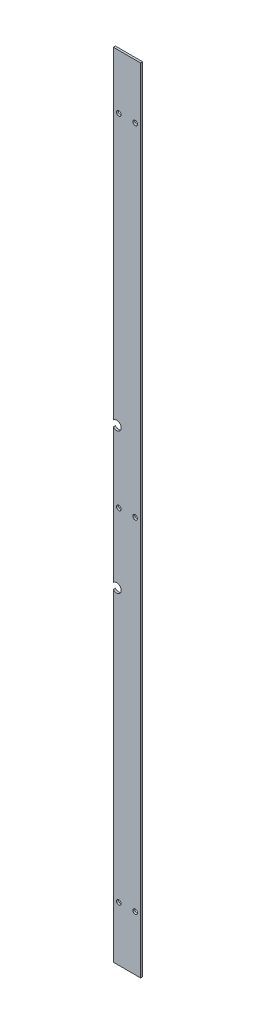
ISO-10303-21;
HEADER;
FILE_DESCRIPTION(('STEP AP214'),'2;1');
FILE_NAME('part.step','',(''),(''),'','','');
FILE_SCHEMA(('AUTOMOTIVE_DESIGN { 1 0 10303 214 1 1 1 1 }'));
ENDSEC;
DATA;
#1=APPLICATION_CONTEXT('core data for automotive mechanical design processes');
#2=APPLICATION_PROTOCOL_DEFINITION('international standard','automotive_design',2000,#1);
#3=PRODUCT_CONTEXT('',#1,'mechanical');
#4=PRODUCT('Part','Part','',(#3));
#5=PRODUCT_RELATED_PRODUCT_CATEGORY('part','',(#4));
#6=PRODUCT_DEFINITION_FORMATION('','',#4);
#7=PRODUCT_DEFINITION_CONTEXT('part definition',#1,'design');
#8=PRODUCT_DEFINITION('design','',#6,#7);
#9=PRODUCT_DEFINITION_SHAPE('','',#8);
#10=(LENGTH_UNIT() NAMED_UNIT(*) SI_UNIT(.MILLI.,.METRE.));
#11=(NAMED_UNIT(*) PLANE_ANGLE_UNIT() SI_UNIT($,.RADIAN.));
#12=(NAMED_UNIT(*) SI_UNIT($,.STERADIAN.) SOLID_ANGLE_UNIT());
#13=UNCERTAINTY_MEASURE_WITH_UNIT(LENGTH_MEASURE(1.E-05),#10,'distance_accuracy_value','');
#14=(GEOMETRIC_REPRESENTATION_CONTEXT(3) GLOBAL_UNCERTAINTY_ASSIGNED_CONTEXT((#13)) GLOBAL_UNIT_ASSIGNED_CONTEXT((#10,
#11,#12)) REPRESENTATION_CONTEXT('',''));
#15=CARTESIAN_POINT('',(0.,0.,0.));
#16=DIRECTION('',(0.,0.,1.));
#17=DIRECTION('',(1.,0.,0.));
#18=AXIS2_PLACEMENT_3D('',#15,#16,#17);
#19=CARTESIAN_POINT('',(75.,-51.4999999999999,108.5));
#20=DIRECTION('',(0.,0.,1.));
#21=DIRECTION('',(1.,0.,0.));
#22=AXIS2_PLACEMENT_3D('',#19,#20,#21);
#23=CYLINDRICAL_SURFACE('',#22,3.29999999999988);
#24=CARTESIAN_POINT('',(75.,-51.4999999999999,110.));
#25=DIRECTION('',(0.,0.,-1.));
#26=DIRECTION('',(1.,0.,0.));
#27=AXIS2_PLACEMENT_3D('',#24,#25,#26);
#28=CIRCLE('',#27,3.29999999999988);
#29=CARTESIAN_POINT('',(72.5000000000001,-49.3459340771464,110.));
#30=VERTEX_POINT('',#29);
#31=CARTESIAN_POINT('',(72.4999999999999,-53.6540659228537,110.));
#32=VERTEX_POINT('',#31);
#33=EDGE_CURVE('E158',#30,#32,#28,.T.);
#34=ORIENTED_EDGE('',*,*,#33,.F.);
#35=DIRECTION('',(0.,0.,1.));
#36=VECTOR('',#35,1.);
#37=CARTESIAN_POINT('',(72.5000000000001,-49.3459340771464,108.5));
#38=LINE('',#37,#36);
#39=CARTESIAN_POINT('',(72.5000000000001,-49.3459340771464,108.5));
#40=VERTEX_POINT('',#39);
#41=EDGE_CURVE('E11',#40,#30,#38,.T.);
#42=ORIENTED_EDGE('',*,*,#41,.F.);
#43=CARTESIAN_POINT('',(75.,-51.4999999999999,108.5));
#44=DIRECTION('',(0.,0.,-1.));
#45=DIRECTION('',(1.,0.,0.));
#46=AXIS2_PLACEMENT_3D('',#43,#44,#45);
#47=CIRCLE('',#46,3.30000000000006);
#48=CARTESIAN_POINT('',(72.4999999999999,-53.6540659228537,108.5));
#49=VERTEX_POINT('',#48);
#50=EDGE_CURVE('E58',#40,#49,#47,.T.);
#51=ORIENTED_EDGE('',*,*,#50,.T.);
#52=DIRECTION('',(0.,0.,1.));
#53=VECTOR('',#52,1.);
#54=CARTESIAN_POINT('',(72.4999999999999,-53.6540659228537,108.5));
#55=LINE('',#54,#53);
#56=EDGE_CURVE('E44',#49,#32,#55,.T.);
#57=ORIENTED_EDGE('',*,*,#56,.T.);
#58=EDGE_LOOP('',(#34,#42,#51,#57));
#59=FACE_BOUND('',#58,.T.);
#60=ADVANCED_FACE('F41',(#59),#23,.F.);
#61=CARTESIAN_POINT('',(72.5,49.3459340771462,108.5));
#62=DIRECTION('',(-1.,0.,0.));
#63=DIRECTION('',(0.,-1.,0.));
#64=AXIS2_PLACEMENT_3D('',#61,#62,#63);
#65=PLANE('',#64);
#66=DIRECTION('',(0.,-1.,0.));
#67=VECTOR('',#66,1.);
#68=CARTESIAN_POINT('',(72.5,49.3459340771462,110.));
#69=LINE('',#68,#67);
#70=CARTESIAN_POINT('',(72.5,49.3459340771462,110.));
#71=VERTEX_POINT('',#70);
#72=EDGE_CURVE('E156',#71,#30,#69,.T.);
#73=ORIENTED_EDGE('',*,*,#72,.F.);
#74=DIRECTION('',(0.,0.,1.));
#75=VECTOR('',#74,1.);
#76=CARTESIAN_POINT('',(72.5,49.3459340771462,108.5));
#77=LINE('',#76,#75);
#78=CARTESIAN_POINT('',(72.5,49.3459340771462,108.5));
#79=VERTEX_POINT('',#78);
#80=EDGE_CURVE('E51',#79,#71,#77,.T.);
#81=ORIENTED_EDGE('',*,*,#80,.F.);
#82=DIRECTION('',(0.,-1.,0.));
#83=VECTOR('',#82,1.);
#84=CARTESIAN_POINT('',(72.5,49.3459340771462,108.5));
#85=LINE('',#84,#83);
#86=EDGE_CURVE('E128',#79,#40,#85,.T.);
#87=ORIENTED_EDGE('',*,*,#86,.T.);
#88=ORIENTED_EDGE('',*,*,#41,.T.);
#89=EDGE_LOOP('',(#73,#81,#87,#88));
#90=FACE_BOUND('',#89,.T.);
#91=ADVANCED_FACE('F172',(#90),#65,.T.);
#92=CARTESIAN_POINT('',(75.0000000000001,51.5000000000001,108.5));
#93=DIRECTION('',(0.,0.,1.));
#94=DIRECTION('',(1.,0.,0.));
#95=AXIS2_PLACEMENT_3D('',#92,#93,#94);
#96=CYLINDRICAL_SURFACE('',#95,3.30000000000015);
#97=CARTESIAN_POINT('',(75.0000000000001,51.5000000000001,110.));
#98=DIRECTION('',(0.,0.,-1.));
#99=DIRECTION('',(1.,0.,0.));
#100=AXIS2_PLACEMENT_3D('',#97,#98,#99);
#101=CIRCLE('',#100,3.30000000000015);
#102=CARTESIAN_POINT('',(72.4999999999998,53.6540659228538,110.));
#103=VERTEX_POINT('',#102);
#104=EDGE_CURVE('E119',#103,#71,#101,.T.);
#105=ORIENTED_EDGE('',*,*,#104,.F.);
#106=DIRECTION('',(0.,0.,1.));
#107=VECTOR('',#106,1.);
#108=CARTESIAN_POINT('',(72.4999999999998,53.6540659228538,108.5));
#109=LINE('',#108,#107);
#110=CARTESIAN_POINT('',(72.4999999999998,53.6540659228538,108.5));
#111=VERTEX_POINT('',#110);
#112=EDGE_CURVE('E114',#111,#103,#109,.T.);
#113=ORIENTED_EDGE('',*,*,#112,.F.);
#114=CARTESIAN_POINT('',(75.0000000000001,51.5000000000001,108.5));
#115=DIRECTION('',(0.,0.,-1.));
#116=DIRECTION('',(1.,0.,0.));
#117=AXIS2_PLACEMENT_3D('',#114,#115,#116);
#118=CIRCLE('',#117,3.30000000000013);
#119=EDGE_CURVE('E117',#111,#79,#118,.T.);
#120=ORIENTED_EDGE('',*,*,#119,.T.);
#121=ORIENTED_EDGE('',*,*,#80,.T.);
#122=EDGE_LOOP('',(#105,#113,#120,#121));
#123=FACE_BOUND('',#122,.T.);
#124=ADVANCED_FACE('F113',(#123),#96,.F.);
#125=CARTESIAN_POINT('',(72.5,290.,108.5));
#126=DIRECTION('',(-1.,0.,0.));
#127=DIRECTION('',(0.,-1.,0.));
#128=AXIS2_PLACEMENT_3D('',#125,#126,#127);
#129=PLANE('',#128);
#130=DIRECTION('',(0.,-1.,0.));
#131=VECTOR('',#130,1.);
#132=CARTESIAN_POINT('',(72.5,290.,110.));
#133=LINE('',#132,#131);
#134=CARTESIAN_POINT('',(72.5,290.,110.));
#135=VERTEX_POINT('',#134);
#136=EDGE_CURVE('E153',#135,#103,#133,.T.);
#137=ORIENTED_EDGE('',*,*,#136,.F.);
#138=DIRECTION('',(0.,0.,1.));
#139=VECTOR('',#138,1.);
#140=CARTESIAN_POINT('',(72.5,290.,108.5));
#141=LINE('',#140,#139);
#142=CARTESIAN_POINT('',(72.5,290.,108.5));
#143=VERTEX_POINT('',#142);
#144=EDGE_CURVE('E124',#143,#135,#141,.T.);
#145=ORIENTED_EDGE('',*,*,#144,.F.);
#146=DIRECTION('',(0.,-1.,0.));
#147=VECTOR('',#146,1.);
#148=CARTESIAN_POINT('',(72.5,290.,108.5));
#149=LINE('',#148,#147);
#150=EDGE_CURVE('E126',#143,#111,#149,.T.);
#151=ORIENTED_EDGE('',*,*,#150,.T.);
#152=ORIENTED_EDGE('',*,*,#112,.T.);
#153=EDGE_LOOP('',(#137,#145,#151,#152));
#154=FACE_BOUND('',#153,.T.);
#155=ADVANCED_FACE('F135',(#154),#129,.T.);
#156=CARTESIAN_POINT('',(72.5,290.,108.5));
#157=DIRECTION('',(0.,1.,0.));
#158=DIRECTION('',(0.,0.,1.));
#159=AXIS2_PLACEMENT_3D('',#156,#157,#158);
#160=PLANE('',#159);
#161=DIRECTION('',(-1.,0.,0.));
#162=VECTOR('',#161,1.);
#163=CARTESIAN_POINT('',(72.5,290.,110.));
#164=LINE('',#163,#162);
#165=CARTESIAN_POINT('',(92.5,290.,110.));
#166=VERTEX_POINT('',#165);
#167=EDGE_CURVE('E147',#166,#135,#164,.T.);
#168=ORIENTED_EDGE('',*,*,#167,.F.);
#169=DIRECTION('',(0.,0.,1.));
#170=VECTOR('',#169,1.);
#171=CARTESIAN_POINT('',(92.5,290.,108.5));
#172=LINE('',#171,#170);
#173=CARTESIAN_POINT('',(92.5,290.,108.5));
#174=VERTEX_POINT('',#173);
#175=EDGE_CURVE('E165',#174,#166,#172,.T.);
#176=ORIENTED_EDGE('',*,*,#175,.F.);
#177=DIRECTION('',(-1.,0.,0.));
#178=VECTOR('',#177,1.);
#179=CARTESIAN_POINT('',(72.5,290.,108.5));
#180=LINE('',#179,#178);
#181=EDGE_CURVE('E134',#174,#143,#180,.T.);
#182=ORIENTED_EDGE('',*,*,#181,.T.);
#183=ORIENTED_EDGE('',*,*,#144,.T.);
#184=EDGE_LOOP('',(#168,#176,#182,#183));
#185=FACE_BOUND('',#184,.T.);
#186=ADVANCED_FACE('F184',(#185),#160,.T.);
#187=CARTESIAN_POINT('',(92.5,290.,108.5));
#188=DIRECTION('',(1.,0.,0.));
#189=DIRECTION('',(0.,0.,-1.));
#190=AXIS2_PLACEMENT_3D('',#187,#188,#189);
#191=PLANE('',#190);
#192=DIRECTION('',(0.,1.,0.));
#193=VECTOR('',#192,1.);
#194=CARTESIAN_POINT('',(92.5,290.,110.));
#195=LINE('',#194,#193);
#196=CARTESIAN_POINT('',(92.5,-290.,110.));
#197=VERTEX_POINT('',#196);
#198=EDGE_CURVE('E150',#197,#166,#195,.T.);
#199=ORIENTED_EDGE('',*,*,#198,.F.);
#200=DIRECTION('',(0.,0.,1.));
#201=VECTOR('',#200,1.);
#202=CARTESIAN_POINT('',(92.5,-290.,108.5));
#203=LINE('',#202,#201);
#204=CARTESIAN_POINT('',(92.5,-290.,108.5));
#205=VERTEX_POINT('',#204);
#206=EDGE_CURVE('E163',#205,#197,#203,.T.);
#207=ORIENTED_EDGE('',*,*,#206,.F.);
#208=DIRECTION('',(0.,1.,0.));
#209=VECTOR('',#208,1.);
#210=CARTESIAN_POINT('',(92.5,290.,108.5));
#211=LINE('',#210,#209);
#212=EDGE_CURVE('E133',#205,#174,#211,.T.);
#213=ORIENTED_EDGE('',*,*,#212,.T.);
#214=ORIENTED_EDGE('',*,*,#175,.T.);
#215=EDGE_LOOP('',(#199,#207,#213,#214));
#216=FACE_BOUND('',#215,.T.);
#217=ADVANCED_FACE('F190',(#216),#191,.T.);
#218=CARTESIAN_POINT('',(72.5,-290.,108.5));
#219=DIRECTION('',(0.,-1.,0.));
#220=DIRECTION('',(0.,0.,-1.));
#221=AXIS2_PLACEMENT_3D('',#218,#219,#220);
#222=PLANE('',#221);
#223=DIRECTION('',(1.,0.,0.));
#224=VECTOR('',#223,1.);
#225=CARTESIAN_POINT('',(72.5,-290.,110.));
#226=LINE('',#225,#224);
#227=CARTESIAN_POINT('',(72.5,-290.,110.));
#228=VERTEX_POINT('',#227);
#229=EDGE_CURVE('E141',#228,#197,#226,.T.);
#230=ORIENTED_EDGE('',*,*,#229,.F.);
#231=DIRECTION('',(0.,0.,1.));
#232=VECTOR('',#231,1.);
#233=CARTESIAN_POINT('',(72.5,-290.,108.5));
#234=LINE('',#233,#232);
#235=CARTESIAN_POINT('',(72.5,-290.,108.5));
#236=VERTEX_POINT('',#235);
#237=EDGE_CURVE('E164',#236,#228,#234,.T.);
#238=ORIENTED_EDGE('',*,*,#237,.F.);
#239=DIRECTION('',(1.,0.,0.));
#240=VECTOR('',#239,1.);
#241=CARTESIAN_POINT('',(72.5,-290.,108.5));
#242=LINE('',#241,#240);
#243=EDGE_CURVE('E199',#236,#205,#242,.T.);
#244=ORIENTED_EDGE('',*,*,#243,.T.);
#245=ORIENTED_EDGE('',*,*,#206,.T.);
#246=EDGE_LOOP('',(#230,#238,#244,#245));
#247=FACE_BOUND('',#246,.T.);
#248=ADVANCED_FACE('F188',(#247),#222,.T.);
#249=CARTESIAN_POINT('',(72.4999999999999,-53.6540659228537,108.5));
#250=DIRECTION('',(-1.,0.,0.));
#251=DIRECTION('',(0.,-1.,0.));
#252=AXIS2_PLACEMENT_3D('',#249,#250,#251);
#253=PLANE('',#252);
#254=DIRECTION('',(0.,-1.,0.));
#255=VECTOR('',#254,1.);
#256=CARTESIAN_POINT('',(72.4999999999999,-53.6540659228537,110.));
#257=LINE('',#256,#255);
#258=EDGE_CURVE('E138',#32,#228,#257,.T.);
#259=ORIENTED_EDGE('',*,*,#258,.F.);
#260=ORIENTED_EDGE('',*,*,#56,.F.);
#261=DIRECTION('',(0.,-1.,0.));
#262=VECTOR('',#261,1.);
#263=CARTESIAN_POINT('',(72.4999999999999,-53.6540659228537,108.5));
#264=LINE('',#263,#262);
#265=EDGE_CURVE('E204',#49,#236,#264,.T.);
#266=ORIENTED_EDGE('',*,*,#265,.T.);
#267=ORIENTED_EDGE('',*,*,#237,.T.);
#268=EDGE_LOOP('',(#259,#260,#266,#267));
#269=FACE_BOUND('',#268,.T.);
#270=ADVANCED_FACE('F43',(#269),#253,.T.);
#271=CARTESIAN_POINT('',(75.,-51.4999999999999,108.5));
#272=DIRECTION('',(0.,0.,1.));
#273=DIRECTION('',(1.,0.,0.));
#274=AXIS2_PLACEMENT_3D('',#271,#272,#273);
#275=PLANE('',#274);
#276=CARTESIAN_POINT('',(88.5,250.,108.5));
#277=DIRECTION('',(0.,0.,1.));
#278=DIRECTION('',(1.,0.,0.));
#279=AXIS2_PLACEMENT_3D('',#276,#277,#278);
#280=CIRCLE('',#279,1.69999999999999);
#281=CARTESIAN_POINT('',(90.2,250.,108.5));
#282=VERTEX_POINT('',#281);
#283=EDGE_CURVE('E237',#282,#282,#280,.T.);
#284=ORIENTED_EDGE('',*,*,#283,.T.);
#285=EDGE_LOOP('',(#284));
#286=FACE_BOUND('',#285,.T.);
#287=CARTESIAN_POINT('',(88.5,0.,108.5));
#288=DIRECTION('',(0.,0.,1.));
#289=DIRECTION('',(1.,0.,0.));
#290=AXIS2_PLACEMENT_3D('',#287,#288,#289);
#291=CIRCLE('',#290,1.69999999999999);
#292=CARTESIAN_POINT('',(90.2,0.,108.5));
#293=VERTEX_POINT('',#292);
#294=EDGE_CURVE('E228',#293,#293,#291,.T.);
#295=ORIENTED_EDGE('',*,*,#294,.T.);
#296=EDGE_LOOP('',(#295));
#297=FACE_BOUND('',#296,.T.);
#298=CARTESIAN_POINT('',(76.5,250.,108.5));
#299=DIRECTION('',(0.,0.,1.));
#300=DIRECTION('',(1.,0.,0.));
#301=AXIS2_PLACEMENT_3D('',#298,#299,#300);
#302=CIRCLE('',#301,1.69999999999999);
#303=CARTESIAN_POINT('',(78.2,250.,108.5));
#304=VERTEX_POINT('',#303);
#305=EDGE_CURVE('E221',#304,#304,#302,.T.);
#306=ORIENTED_EDGE('',*,*,#305,.T.);
#307=EDGE_LOOP('',(#306));
#308=FACE_BOUND('',#307,.T.);
#309=CARTESIAN_POINT('',(76.5,0.,108.5));
#310=DIRECTION('',(0.,0.,1.));
#311=DIRECTION('',(1.,0.,0.));
#312=AXIS2_PLACEMENT_3D('',#309,#310,#311);
#313=CIRCLE('',#312,1.69999999999999);
#314=CARTESIAN_POINT('',(78.2,0.,108.5));
#315=VERTEX_POINT('',#314);
#316=EDGE_CURVE('E217',#315,#315,#313,.T.);
#317=ORIENTED_EDGE('',*,*,#316,.T.);
#318=EDGE_LOOP('',(#317));
#319=FACE_BOUND('',#318,.T.);
#320=CARTESIAN_POINT('',(88.5,-250.,108.5));
#321=DIRECTION('',(0.,0.,1.));
#322=DIRECTION('',(1.,0.,0.));
#323=AXIS2_PLACEMENT_3D('',#320,#321,#322);
#324=CIRCLE('',#323,1.69999999999999);
#325=CARTESIAN_POINT('',(90.2,-250.,108.5));
#326=VERTEX_POINT('',#325);
#327=EDGE_CURVE('E215',#326,#326,#324,.T.);
#328=ORIENTED_EDGE('',*,*,#327,.T.);
#329=EDGE_LOOP('',(#328));
#330=FACE_BOUND('',#329,.T.);
#331=CARTESIAN_POINT('',(76.5,-250.,108.5));
#332=DIRECTION('',(0.,0.,1.));
#333=DIRECTION('',(1.,0.,0.));
#334=AXIS2_PLACEMENT_3D('',#331,#332,#333);
#335=CIRCLE('',#334,1.69999999999999);
#336=CARTESIAN_POINT('',(78.2,-250.,108.5));
#337=VERTEX_POINT('',#336);
#338=EDGE_CURVE('E145',#337,#337,#335,.T.);
#339=ORIENTED_EDGE('',*,*,#338,.T.);
#340=EDGE_LOOP('',(#339));
#341=FACE_BOUND('',#340,.T.);
#342=ORIENTED_EDGE('',*,*,#50,.F.);
#343=ORIENTED_EDGE('',*,*,#86,.F.);
#344=ORIENTED_EDGE('',*,*,#119,.F.);
#345=ORIENTED_EDGE('',*,*,#150,.F.);
#346=ORIENTED_EDGE('',*,*,#181,.F.);
#347=ORIENTED_EDGE('',*,*,#212,.F.);
#348=ORIENTED_EDGE('',*,*,#243,.F.);
#349=ORIENTED_EDGE('',*,*,#265,.F.);
#350=EDGE_LOOP('',(#342,#343,#344,#345,#346,#347,#348,#349));
#351=FACE_BOUND('',#350,.T.);
#352=ADVANCED_FACE('F127',(#286,#297,#308,#319,#330,#341,#351),#275,.F.);
#353=CARTESIAN_POINT('',(75.,-51.4999999999999,110.));
#354=DIRECTION('',(0.,0.,1.));
#355=DIRECTION('',(1.,0.,0.));
#356=AXIS2_PLACEMENT_3D('',#353,#354,#355);
#357=PLANE('',#356);
#358=CARTESIAN_POINT('',(88.5,250.,110.));
#359=DIRECTION('',(0.,0.,1.));
#360=DIRECTION('',(1.,0.,0.));
#361=AXIS2_PLACEMENT_3D('',#358,#359,#360);
#362=CIRCLE('',#361,1.69999999999999);
#363=CARTESIAN_POINT('',(90.2,250.,110.));
#364=VERTEX_POINT('',#363);
#365=EDGE_CURVE('E239',#364,#364,#362,.T.);
#366=ORIENTED_EDGE('',*,*,#365,.F.);
#367=EDGE_LOOP('',(#366));
#368=FACE_BOUND('',#367,.T.);
#369=CARTESIAN_POINT('',(88.5,0.,110.));
#370=DIRECTION('',(0.,0.,1.));
#371=DIRECTION('',(1.,0.,0.));
#372=AXIS2_PLACEMENT_3D('',#369,#370,#371);
#373=CIRCLE('',#372,1.69999999999999);
#374=CARTESIAN_POINT('',(90.2,0.,110.));
#375=VERTEX_POINT('',#374);
#376=EDGE_CURVE('E234',#375,#375,#373,.T.);
#377=ORIENTED_EDGE('',*,*,#376,.F.);
#378=EDGE_LOOP('',(#377));
#379=FACE_BOUND('',#378,.T.);
#380=CARTESIAN_POINT('',(76.5,250.,110.));
#381=DIRECTION('',(0.,0.,1.));
#382=DIRECTION('',(1.,0.,0.));
#383=AXIS2_PLACEMENT_3D('',#380,#381,#382);
#384=CIRCLE('',#383,1.69999999999999);
#385=CARTESIAN_POINT('',(78.2,250.,110.));
#386=VERTEX_POINT('',#385);
#387=EDGE_CURVE('E230',#386,#386,#384,.T.);
#388=ORIENTED_EDGE('',*,*,#387,.F.);
#389=EDGE_LOOP('',(#388));
#390=FACE_BOUND('',#389,.T.);
#391=CARTESIAN_POINT('',(76.5,0.,110.));
#392=DIRECTION('',(0.,0.,1.));
#393=DIRECTION('',(1.,0.,0.));
#394=AXIS2_PLACEMENT_3D('',#391,#392,#393);
#395=CIRCLE('',#394,1.69999999999999);
#396=CARTESIAN_POINT('',(78.2,0.,110.));
#397=VERTEX_POINT('',#396);
#398=EDGE_CURVE('E222',#397,#397,#395,.T.);
#399=ORIENTED_EDGE('',*,*,#398,.F.);
#400=EDGE_LOOP('',(#399));
#401=FACE_BOUND('',#400,.T.);
#402=CARTESIAN_POINT('',(88.5,-250.,110.));
#403=DIRECTION('',(0.,0.,1.));
#404=DIRECTION('',(1.,0.,0.));
#405=AXIS2_PLACEMENT_3D('',#402,#403,#404);
#406=CIRCLE('',#405,1.69999999999999);
#407=CARTESIAN_POINT('',(90.2,-250.,110.));
#408=VERTEX_POINT('',#407);
#409=EDGE_CURVE('E214',#408,#408,#406,.T.);
#410=ORIENTED_EDGE('',*,*,#409,.F.);
#411=EDGE_LOOP('',(#410));
#412=FACE_BOUND('',#411,.T.);
#413=CARTESIAN_POINT('',(76.5,-250.,110.));
#414=DIRECTION('',(0.,0.,1.));
#415=DIRECTION('',(1.,0.,0.));
#416=AXIS2_PLACEMENT_3D('',#413,#414,#415);
#417=CIRCLE('',#416,1.69999999999999);
#418=CARTESIAN_POINT('',(78.2,-250.,110.));
#419=VERTEX_POINT('',#418);
#420=EDGE_CURVE('E207',#419,#419,#417,.T.);
#421=ORIENTED_EDGE('',*,*,#420,.F.);
#422=EDGE_LOOP('',(#421));
#423=FACE_BOUND('',#422,.T.);
#424=ORIENTED_EDGE('',*,*,#33,.T.);
#425=ORIENTED_EDGE('',*,*,#258,.T.);
#426=ORIENTED_EDGE('',*,*,#229,.T.);
#427=ORIENTED_EDGE('',*,*,#198,.T.);
#428=ORIENTED_EDGE('',*,*,#167,.T.);
#429=ORIENTED_EDGE('',*,*,#136,.T.);
#430=ORIENTED_EDGE('',*,*,#104,.T.);
#431=ORIENTED_EDGE('',*,*,#72,.T.);
#432=EDGE_LOOP('',(#424,#425,#426,#427,#428,#429,#430,#431));
#433=FACE_BOUND('',#432,.T.);
#434=ADVANCED_FACE('F168',(#368,#379,#390,#401,#412,#423,#433),#357,.T.);
#435=CARTESIAN_POINT('',(76.5,-250.,108.5));
#436=DIRECTION('',(0.,0.,1.));
#437=DIRECTION('',(1.,0.,0.));
#438=AXIS2_PLACEMENT_3D('',#435,#436,#437);
#439=CYLINDRICAL_SURFACE('',#438,1.69999999999999);
#440=ORIENTED_EDGE('',*,*,#338,.F.);
#441=EDGE_LOOP('',(#440));
#442=FACE_BOUND('',#441,.T.);
#443=ORIENTED_EDGE('',*,*,#420,.T.);
#444=EDGE_LOOP('',(#443));
#445=FACE_BOUND('',#444,.T.);
#446=ADVANCED_FACE('F258',(#442,#445),#439,.F.);
#447=CARTESIAN_POINT('',(88.5,-250.,108.5));
#448=DIRECTION('',(0.,0.,1.));
#449=DIRECTION('',(1.,0.,0.));
#450=AXIS2_PLACEMENT_3D('',#447,#448,#449);
#451=CYLINDRICAL_SURFACE('',#450,1.69999999999999);
#452=ORIENTED_EDGE('',*,*,#327,.F.);
#453=EDGE_LOOP('',(#452));
#454=FACE_BOUND('',#453,.T.);
#455=ORIENTED_EDGE('',*,*,#409,.T.);
#456=EDGE_LOOP('',(#455));
#457=FACE_BOUND('',#456,.T.);
#458=ADVANCED_FACE('F268',(#454,#457),#451,.F.);
#459=CARTESIAN_POINT('',(76.5,0.,108.5));
#460=DIRECTION('',(0.,0.,1.));
#461=DIRECTION('',(1.,0.,0.));
#462=AXIS2_PLACEMENT_3D('',#459,#460,#461);
#463=CYLINDRICAL_SURFACE('',#462,1.69999999999999);
#464=ORIENTED_EDGE('',*,*,#316,.F.);
#465=EDGE_LOOP('',(#464));
#466=FACE_BOUND('',#465,.T.);
#467=ORIENTED_EDGE('',*,*,#398,.T.);
#468=EDGE_LOOP('',(#467));
#469=FACE_BOUND('',#468,.T.);
#470=ADVANCED_FACE('F273',(#466,#469),#463,.F.);
#471=CARTESIAN_POINT('',(76.5,250.,108.5));
#472=DIRECTION('',(0.,0.,1.));
#473=DIRECTION('',(1.,0.,0.));
#474=AXIS2_PLACEMENT_3D('',#471,#472,#473);
#475=CYLINDRICAL_SURFACE('',#474,1.69999999999999);
#476=ORIENTED_EDGE('',*,*,#305,.F.);
#477=EDGE_LOOP('',(#476));
#478=FACE_BOUND('',#477,.T.);
#479=ORIENTED_EDGE('',*,*,#387,.T.);
#480=EDGE_LOOP('',(#479));
#481=FACE_BOUND('',#480,.T.);
#482=ADVANCED_FACE('F309',(#478,#481),#475,.F.);
#483=CARTESIAN_POINT('',(88.5,0.,108.5));
#484=DIRECTION('',(0.,0.,1.));
#485=DIRECTION('',(1.,0.,0.));
#486=AXIS2_PLACEMENT_3D('',#483,#484,#485);
#487=CYLINDRICAL_SURFACE('',#486,1.69999999999999);
#488=ORIENTED_EDGE('',*,*,#294,.F.);
#489=EDGE_LOOP('',(#488));
#490=FACE_BOUND('',#489,.T.);
#491=ORIENTED_EDGE('',*,*,#376,.T.);
#492=EDGE_LOOP('',(#491));
#493=FACE_BOUND('',#492,.T.);
#494=ADVANCED_FACE('F248',(#490,#493),#487,.F.);
#495=CARTESIAN_POINT('',(88.5,250.,108.5));
#496=DIRECTION('',(0.,0.,1.));
#497=DIRECTION('',(1.,0.,0.));
#498=AXIS2_PLACEMENT_3D('',#495,#496,#497);
#499=CYLINDRICAL_SURFACE('',#498,1.69999999999999);
#500=ORIENTED_EDGE('',*,*,#283,.F.);
#501=EDGE_LOOP('',(#500));
#502=FACE_BOUND('',#501,.T.);
#503=ORIENTED_EDGE('',*,*,#365,.T.);
#504=EDGE_LOOP('',(#503));
#505=FACE_BOUND('',#504,.T.);
#506=ADVANCED_FACE('F250',(#502,#505),#499,.F.);
#507=CLOSED_SHELL('',(#60,#91,#124,#155,#186,#217,#248,#270,#352,#434,#446,#458,#470,#482,#494,#506));
#508=MANIFOLD_SOLID_BREP('B2',#507);
#509=ADVANCED_BREP_SHAPE_REPRESENTATION('',(#18,#508),#14);
#510=SHAPE_DEFINITION_REPRESENTATION(#9,#509);
ENDSEC;
END-ISO-10303-21;
